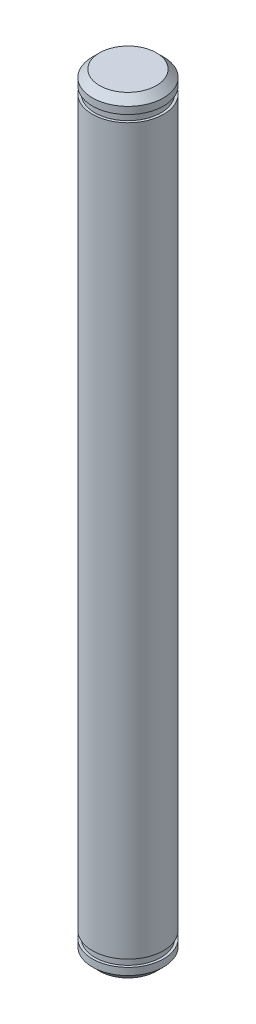
ISO-10303-21;
HEADER;
FILE_DESCRIPTION(('STEP AP214'),'2;1');
FILE_NAME('part.step','',(''),(''),'','','');
FILE_SCHEMA(('AUTOMOTIVE_DESIGN { 1 0 10303 214 1 1 1 1 }'));
ENDSEC;
DATA;
#1=APPLICATION_CONTEXT('core data for automotive mechanical design processes');
#2=APPLICATION_PROTOCOL_DEFINITION('international standard','automotive_design',2000,#1);
#3=PRODUCT_CONTEXT('',#1,'mechanical');
#4=PRODUCT('Part','Part','',(#3));
#5=PRODUCT_RELATED_PRODUCT_CATEGORY('part','',(#4));
#6=PRODUCT_DEFINITION_FORMATION('','',#4);
#7=PRODUCT_DEFINITION_CONTEXT('part definition',#1,'design');
#8=PRODUCT_DEFINITION('design','',#6,#7);
#9=PRODUCT_DEFINITION_SHAPE('','',#8);
#10=(LENGTH_UNIT() NAMED_UNIT(*) SI_UNIT(.MILLI.,.METRE.));
#11=(NAMED_UNIT(*) PLANE_ANGLE_UNIT() SI_UNIT($,.RADIAN.));
#12=(NAMED_UNIT(*) SI_UNIT($,.STERADIAN.) SOLID_ANGLE_UNIT());
#13=UNCERTAINTY_MEASURE_WITH_UNIT(LENGTH_MEASURE(1.E-05),#10,'distance_accuracy_value','');
#14=(GEOMETRIC_REPRESENTATION_CONTEXT(3) GLOBAL_UNCERTAINTY_ASSIGNED_CONTEXT((#13)) GLOBAL_UNIT_ASSIGNED_CONTEXT((#10,
#11,#12)) REPRESENTATION_CONTEXT('',''));
#15=CARTESIAN_POINT('',(0.,0.,0.));
#16=DIRECTION('',(0.,0.,1.));
#17=DIRECTION('',(1.,0.,0.));
#18=AXIS2_PLACEMENT_3D('',#15,#16,#17);
#19=CARTESIAN_POINT('',(0.,54.,0.));
#20=DIRECTION('',(0.,1.,0.));
#21=DIRECTION('',(-1.,0.,0.));
#22=AXIS2_PLACEMENT_3D('',#19,#20,#21);
#23=CYLINDRICAL_SURFACE('',#22,5.00000000000001);
#24=CARTESIAN_POINT('',(0.,51.,0.));
#25=DIRECTION('',(0.,1.,0.));
#26=DIRECTION('',(-1.,0.,0.));
#27=AXIS2_PLACEMENT_3D('',#24,#25,#26);
#28=CIRCLE('',#27,5.00000000000001);
#29=CARTESIAN_POINT('',(-5.00000000000002,51.,0.));
#30=VERTEX_POINT('',#29);
#31=EDGE_CURVE('E57',#30,#30,#28,.T.);
#32=ORIENTED_EDGE('',*,*,#31,.F.);
#33=EDGE_LOOP('',(#32));
#34=FACE_BOUND('',#33,.T.);
#35=CARTESIAN_POINT('',(0.,-51.,0.));
#36=DIRECTION('',(0.,1.,0.));
#37=DIRECTION('',(-1.,0.,0.));
#38=AXIS2_PLACEMENT_3D('',#35,#36,#37);
#39=CIRCLE('',#38,5.00000000000001);
#40=CARTESIAN_POINT('',(-5.,-51.,0.));
#41=VERTEX_POINT('',#40);
#42=EDGE_CURVE('E69',#41,#41,#39,.T.);
#43=ORIENTED_EDGE('',*,*,#42,.T.);
#44=EDGE_LOOP('',(#43));
#45=FACE_BOUND('',#44,.T.);
#46=ADVANCED_FACE('F35',(#34,#45),#23,.T.);
#47=CARTESIAN_POINT('',(0.,54.,0.));
#48=DIRECTION('',(0.,-1.,0.));
#49=DIRECTION('',(1.,0.,0.));
#50=AXIS2_PLACEMENT_3D('',#47,#48,#49);
#51=PLANE('',#50);
#52=CARTESIAN_POINT('',(0.,54.,0.));
#53=DIRECTION('',(0.,-1.,0.));
#54=DIRECTION('',(1.,0.,0.));
#55=AXIS2_PLACEMENT_3D('',#52,#53,#54);
#56=CIRCLE('',#55,4.00000000000002);
#57=CARTESIAN_POINT('',(4.,54.,0.));
#58=VERTEX_POINT('',#57);
#59=EDGE_CURVE('E10',#58,#58,#56,.F.);
#60=ORIENTED_EDGE('',*,*,#59,.T.);
#61=EDGE_LOOP('',(#60));
#62=FACE_BOUND('',#61,.T.);
#63=ADVANCED_FACE('F110',(#62),#51,.F.);
#64=CARTESIAN_POINT('',(0.,52.,0.));
#65=DIRECTION('',(0.,1.,0.));
#66=DIRECTION('',(-1.,0.,0.));
#67=AXIS2_PLACEMENT_3D('',#64,#65,#66);
#68=CIRCLE('',#67,5.00000000000001);
#69=CARTESIAN_POINT('',(-5.00000000000002,52.,0.));
#70=VERTEX_POINT('',#69);
#71=EDGE_CURVE('E56',#70,#70,#68,.T.);
#72=ORIENTED_EDGE('',*,*,#71,.T.);
#73=EDGE_LOOP('',(#72));
#74=FACE_BOUND('',#73,.T.);
#75=CARTESIAN_POINT('',(0.,53.,0.));
#76=DIRECTION('',(0.,-1.,0.));
#77=DIRECTION('',(1.,0.,0.));
#78=AXIS2_PLACEMENT_3D('',#75,#76,#77);
#79=CIRCLE('',#78,5.00000000000001);
#80=CARTESIAN_POINT('',(4.99999999999999,53.,0.));
#81=VERTEX_POINT('',#80);
#82=EDGE_CURVE('E51',#81,#81,#79,.T.);
#83=ORIENTED_EDGE('',*,*,#82,.T.);
#84=EDGE_LOOP('',(#83));
#85=FACE_BOUND('',#84,.T.);
#86=ADVANCED_FACE('F97',(#74,#85),#23,.T.);
#87=CARTESIAN_POINT('',(0.,54.,0.));
#88=DIRECTION('',(0.,-1.,0.));
#89=DIRECTION('',(1.,0.,0.));
#90=AXIS2_PLACEMENT_3D('',#87,#88,#89);
#91=CONICAL_SURFACE('',#90,4.00000000000002,0.785398163397447);
#92=ORIENTED_EDGE('',*,*,#82,.F.);
#93=EDGE_LOOP('',(#92));
#94=FACE_BOUND('',#93,.T.);
#95=ORIENTED_EDGE('',*,*,#59,.F.);
#96=EDGE_LOOP('',(#95));
#97=FACE_BOUND('',#96,.T.);
#98=ADVANCED_FACE('F38',(#94,#97),#91,.T.);
#99=CARTESIAN_POINT('',(0.,52.,0.));
#100=DIRECTION('',(0.,1.,0.));
#101=DIRECTION('',(-1.,0.,0.));
#102=AXIS2_PLACEMENT_3D('',#99,#100,#101);
#103=PLANE('',#102);
#104=ORIENTED_EDGE('',*,*,#71,.F.);
#105=EDGE_LOOP('',(#104));
#106=FACE_BOUND('',#105,.T.);
#107=CARTESIAN_POINT('',(0.,52.,0.));
#108=DIRECTION('',(0.,1.,0.));
#109=DIRECTION('',(-1.,0.,0.));
#110=AXIS2_PLACEMENT_3D('',#107,#108,#109);
#111=CIRCLE('',#110,4.65);
#112=CARTESIAN_POINT('',(-4.65000000000002,52.,0.));
#113=VERTEX_POINT('',#112);
#114=EDGE_CURVE('E60',#113,#113,#111,.T.);
#115=ORIENTED_EDGE('',*,*,#114,.T.);
#116=EDGE_LOOP('',(#115));
#117=FACE_BOUND('',#116,.T.);
#118=ADVANCED_FACE('F122',(#106,#117),#103,.F.);
#119=CARTESIAN_POINT('',(0.,51.,0.));
#120=DIRECTION('',(0.,1.,0.));
#121=DIRECTION('',(-1.,0.,0.));
#122=AXIS2_PLACEMENT_3D('',#119,#120,#121);
#123=PLANE('',#122);
#124=ORIENTED_EDGE('',*,*,#31,.T.);
#125=EDGE_LOOP('',(#124));
#126=FACE_BOUND('',#125,.T.);
#127=CARTESIAN_POINT('',(0.,51.,0.));
#128=DIRECTION('',(0.,1.,0.));
#129=DIRECTION('',(-1.,0.,0.));
#130=AXIS2_PLACEMENT_3D('',#127,#128,#129);
#131=CIRCLE('',#130,4.65);
#132=CARTESIAN_POINT('',(-4.65000000000002,51.,0.));
#133=VERTEX_POINT('',#132);
#134=EDGE_CURVE('E63',#133,#133,#131,.T.);
#135=ORIENTED_EDGE('',*,*,#134,.F.);
#136=EDGE_LOOP('',(#135));
#137=FACE_BOUND('',#136,.T.);
#138=ADVANCED_FACE('F131',(#126,#137),#123,.T.);
#139=CARTESIAN_POINT('',(0.,52.,0.));
#140=DIRECTION('',(0.,-1.,0.));
#141=DIRECTION('',(1.,0.,0.));
#142=AXIS2_PLACEMENT_3D('',#139,#140,#141);
#143=CYLINDRICAL_SURFACE('',#142,4.65);
#144=ORIENTED_EDGE('',*,*,#114,.F.);
#145=EDGE_LOOP('',(#144));
#146=FACE_BOUND('',#145,.T.);
#147=ORIENTED_EDGE('',*,*,#134,.T.);
#148=EDGE_LOOP('',(#147));
#149=FACE_BOUND('',#148,.T.);
#150=ADVANCED_FACE('F88',(#146,#149),#143,.T.);
#151=CARTESIAN_POINT('',(0.,-52.,0.));
#152=DIRECTION('',(0.,-1.,0.));
#153=DIRECTION('',(-1.,0.,0.));
#154=AXIS2_PLACEMENT_3D('',#151,#152,#153);
#155=PLANE('',#154);
#156=CARTESIAN_POINT('',(0.,-52.,0.));
#157=DIRECTION('',(0.,1.,0.));
#158=DIRECTION('',(-1.,0.,0.));
#159=AXIS2_PLACEMENT_3D('',#156,#157,#158);
#160=CIRCLE('',#159,4.65);
#161=CARTESIAN_POINT('',(-4.64999999999999,-52.,0.));
#162=VERTEX_POINT('',#161);
#163=EDGE_CURVE('E72',#162,#162,#160,.T.);
#164=ORIENTED_EDGE('',*,*,#163,.F.);
#165=EDGE_LOOP('',(#164));
#166=FACE_BOUND('',#165,.T.);
#167=CARTESIAN_POINT('',(0.,-52.,0.));
#168=DIRECTION('',(0.,1.,0.));
#169=DIRECTION('',(-1.,0.,0.));
#170=AXIS2_PLACEMENT_3D('',#167,#168,#169);
#171=CIRCLE('',#170,5.00000000000001);
#172=CARTESIAN_POINT('',(-5.,-52.,0.));
#173=VERTEX_POINT('',#172);
#174=EDGE_CURVE('E66',#173,#173,#171,.T.);
#175=ORIENTED_EDGE('',*,*,#174,.T.);
#176=EDGE_LOOP('',(#175));
#177=FACE_BOUND('',#176,.T.);
#178=ADVANCED_FACE('F84',(#166,#177),#155,.F.);
#179=CARTESIAN_POINT('',(0.,-51.,0.));
#180=DIRECTION('',(0.,-1.,0.));
#181=DIRECTION('',(-1.,0.,0.));
#182=AXIS2_PLACEMENT_3D('',#179,#180,#181);
#183=PLANE('',#182);
#184=CARTESIAN_POINT('',(0.,-51.,0.));
#185=DIRECTION('',(0.,1.,0.));
#186=DIRECTION('',(-1.,0.,0.));
#187=AXIS2_PLACEMENT_3D('',#184,#185,#186);
#188=CIRCLE('',#187,4.65);
#189=CARTESIAN_POINT('',(-4.64999999999999,-51.,0.));
#190=VERTEX_POINT('',#189);
#191=EDGE_CURVE('E75',#190,#190,#188,.T.);
#192=ORIENTED_EDGE('',*,*,#191,.T.);
#193=EDGE_LOOP('',(#192));
#194=FACE_BOUND('',#193,.T.);
#195=ORIENTED_EDGE('',*,*,#42,.F.);
#196=EDGE_LOOP('',(#195));
#197=FACE_BOUND('',#196,.T.);
#198=ADVANCED_FACE('F87',(#194,#197),#183,.T.);
#199=CARTESIAN_POINT('',(0.,-52.,0.));
#200=DIRECTION('',(0.,1.,0.));
#201=DIRECTION('',(-1.,0.,0.));
#202=AXIS2_PLACEMENT_3D('',#199,#200,#201);
#203=CYLINDRICAL_SURFACE('',#202,4.65);
#204=ORIENTED_EDGE('',*,*,#163,.T.);
#205=EDGE_LOOP('',(#204));
#206=FACE_BOUND('',#205,.T.);
#207=ORIENTED_EDGE('',*,*,#191,.F.);
#208=EDGE_LOOP('',(#207));
#209=FACE_BOUND('',#208,.T.);
#210=ADVANCED_FACE('F81',(#206,#209),#203,.T.);
#211=CARTESIAN_POINT('',(5.00000000000002,-54.,0.));
#212=DIRECTION('',(0.,1.,0.));
#213=DIRECTION('',(-1.,0.,0.));
#214=AXIS2_PLACEMENT_3D('',#211,#212,#213);
#215=PLANE('',#214);
#216=CARTESIAN_POINT('',(0.,-54.,0.));
#217=DIRECTION('',(0.,1.,0.));
#218=DIRECTION('',(-1.,0.,0.));
#219=AXIS2_PLACEMENT_3D('',#216,#217,#218);
#220=CIRCLE('',#219,4.00000000000009);
#221=CARTESIAN_POINT('',(-4.00000000000008,-54.,0.));
#222=VERTEX_POINT('',#221);
#223=EDGE_CURVE('E43',#222,#222,#220,.F.);
#224=ORIENTED_EDGE('',*,*,#223,.T.);
#225=EDGE_LOOP('',(#224));
#226=FACE_BOUND('',#225,.T.);
#227=ADVANCED_FACE('F101',(#226),#215,.F.);
#228=CARTESIAN_POINT('',(0.,-53.0000000000001,0.));
#229=DIRECTION('',(0.,1.,0.));
#230=DIRECTION('',(-1.,0.,0.));
#231=AXIS2_PLACEMENT_3D('',#228,#229,#230);
#232=CONICAL_SURFACE('',#231,5.00000000000001,0.785398163397457);
#233=ORIENTED_EDGE('',*,*,#223,.F.);
#234=EDGE_LOOP('',(#233));
#235=FACE_BOUND('',#234,.T.);
#236=CARTESIAN_POINT('',(0.,-53.0000000000001,0.));
#237=DIRECTION('',(0.,1.,0.));
#238=DIRECTION('',(-1.,0.,0.));
#239=AXIS2_PLACEMENT_3D('',#236,#237,#238);
#240=CIRCLE('',#239,5.00000000000001);
#241=CARTESIAN_POINT('',(-5.,-53.0000000000001,0.));
#242=VERTEX_POINT('',#241);
#243=EDGE_CURVE('E47',#242,#242,#240,.T.);
#244=ORIENTED_EDGE('',*,*,#243,.F.);
#245=EDGE_LOOP('',(#244));
#246=FACE_BOUND('',#245,.T.);
#247=ADVANCED_FACE('F95',(#235,#246),#232,.T.);
#248=ORIENTED_EDGE('',*,*,#174,.F.);
#249=EDGE_LOOP('',(#248));
#250=FACE_BOUND('',#249,.T.);
#251=ORIENTED_EDGE('',*,*,#243,.T.);
#252=EDGE_LOOP('',(#251));
#253=FACE_BOUND('',#252,.T.);
#254=ADVANCED_FACE('F92',(#250,#253),#23,.T.);
#255=CLOSED_SHELL('',(#46,#63,#86,#98,#118,#138,#150,#178,#198,#210,#227,#247,#254));
#256=MANIFOLD_SOLID_BREP('B2',#255);
#257=ADVANCED_BREP_SHAPE_REPRESENTATION('',(#18,#256),#14);
#258=SHAPE_DEFINITION_REPRESENTATION(#9,#257);
ENDSEC;
END-ISO-10303-21;
